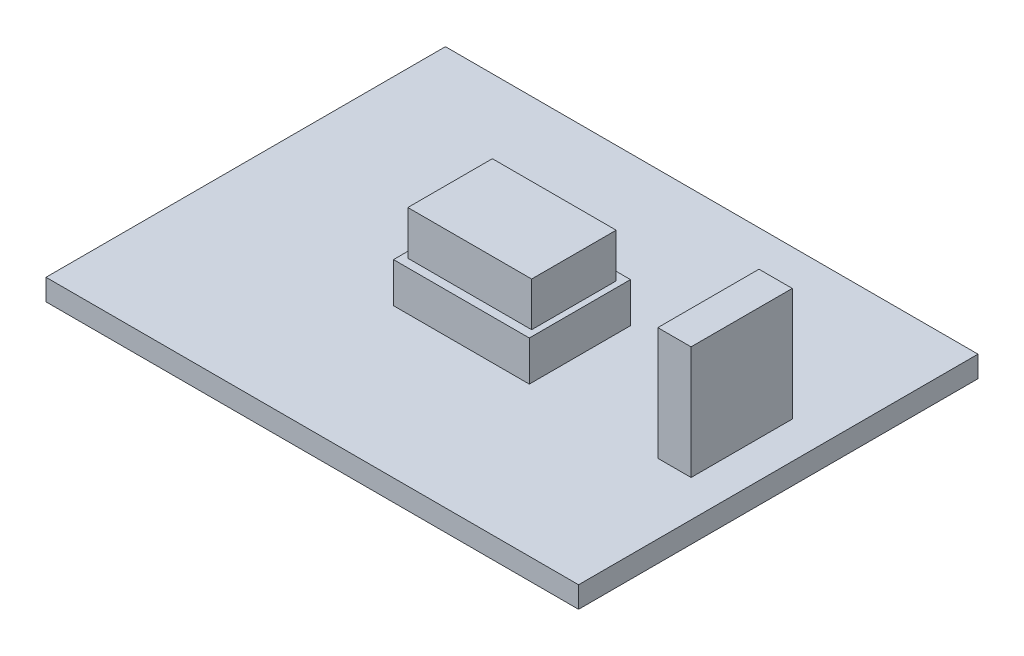
ISO-10303-21;
HEADER;
FILE_DESCRIPTION(('STEP AP214'),'2;1');
FILE_NAME('part.step','',(''),(''),'','','');
FILE_SCHEMA(('AUTOMOTIVE_DESIGN { 1 0 10303 214 1 1 1 1 }'));
ENDSEC;
DATA;
#1=APPLICATION_CONTEXT('core data for automotive mechanical design processes');
#2=APPLICATION_PROTOCOL_DEFINITION('international standard','automotive_design',2000,#1);
#3=PRODUCT_CONTEXT('',#1,'mechanical');
#4=PRODUCT('Part','Part','',(#3));
#5=PRODUCT_RELATED_PRODUCT_CATEGORY('part','',(#4));
#6=PRODUCT_DEFINITION_FORMATION('','',#4);
#7=PRODUCT_DEFINITION_CONTEXT('part definition',#1,'design');
#8=PRODUCT_DEFINITION('design','',#6,#7);
#9=PRODUCT_DEFINITION_SHAPE('','',#8);
#10=(LENGTH_UNIT() NAMED_UNIT(*) SI_UNIT(.MILLI.,.METRE.));
#11=(NAMED_UNIT(*) PLANE_ANGLE_UNIT() SI_UNIT($,.RADIAN.));
#12=(NAMED_UNIT(*) SI_UNIT($,.STERADIAN.) SOLID_ANGLE_UNIT());
#13=UNCERTAINTY_MEASURE_WITH_UNIT(LENGTH_MEASURE(1.E-05),#10,'distance_accuracy_value','');
#14=(GEOMETRIC_REPRESENTATION_CONTEXT(3) GLOBAL_UNCERTAINTY_ASSIGNED_CONTEXT((#13)) GLOBAL_UNIT_ASSIGNED_CONTEXT((#10,
#11,#12)) REPRESENTATION_CONTEXT('',''));
#15=CARTESIAN_POINT('',(0.,0.,0.));
#16=DIRECTION('',(0.,0.,1.));
#17=DIRECTION('',(1.,0.,0.));
#18=AXIS2_PLACEMENT_3D('',#15,#16,#17);
#19=CARTESIAN_POINT('',(0.,1.6,0.));
#20=DIRECTION('',(0.,1.,0.));
#21=DIRECTION('',(0.,0.,1.));
#22=AXIS2_PLACEMENT_3D('',#19,#20,#21);
#23=PLANE('',#22);
#24=DIRECTION('',(0.,0.,1.));
#25=VECTOR('',#24,1.);
#26=CARTESIAN_POINT('',(-5.1,1.6,-3.8));
#27=LINE('',#26,#25);
#28=CARTESIAN_POINT('',(-5.1,1.6,-3.8));
#29=VERTEX_POINT('',#28);
#30=CARTESIAN_POINT('',(-5.1,1.6,3.8));
#31=VERTEX_POINT('',#30);
#32=EDGE_CURVE('E218',#29,#31,#27,.T.);
#33=ORIENTED_EDGE('',*,*,#32,.F.);
#34=DIRECTION('',(-1.,0.,0.));
#35=VECTOR('',#34,1.);
#36=CARTESIAN_POINT('',(5.1,1.6,-3.8));
#37=LINE('',#36,#35);
#38=CARTESIAN_POINT('',(5.1,1.6,-3.8));
#39=VERTEX_POINT('',#38);
#40=EDGE_CURVE('E221',#39,#29,#37,.T.);
#41=ORIENTED_EDGE('',*,*,#40,.F.);
#42=DIRECTION('',(0.,0.,-1.));
#43=VECTOR('',#42,1.);
#44=CARTESIAN_POINT('',(5.1,1.6,3.8));
#45=LINE('',#44,#43);
#46=CARTESIAN_POINT('',(5.1,1.6,3.8));
#47=VERTEX_POINT('',#46);
#48=EDGE_CURVE('E237',#47,#39,#45,.T.);
#49=ORIENTED_EDGE('',*,*,#48,.F.);
#50=DIRECTION('',(1.,0.,0.));
#51=VECTOR('',#50,1.);
#52=CARTESIAN_POINT('',(-5.1,1.6,3.8));
#53=LINE('',#52,#51);
#54=EDGE_CURVE('E234',#31,#47,#53,.T.);
#55=ORIENTED_EDGE('',*,*,#54,.F.);
#56=EDGE_LOOP('',(#33,#41,#49,#55));
#57=FACE_BOUND('',#56,.T.);
#58=DIRECTION('',(0.,0.,1.));
#59=VECTOR('',#58,1.);
#60=CARTESIAN_POINT('',(-20.,1.6,-15.));
#61=LINE('',#60,#59);
#62=CARTESIAN_POINT('',(-20.,1.6,-15.));
#63=VERTEX_POINT('',#62);
#64=CARTESIAN_POINT('',(-20.,1.6,15.));
#65=VERTEX_POINT('',#64);
#66=EDGE_CURVE('E251',#63,#65,#61,.T.);
#67=ORIENTED_EDGE('',*,*,#66,.T.);
#68=DIRECTION('',(1.,0.,0.));
#69=VECTOR('',#68,1.);
#70=CARTESIAN_POINT('',(-20.,1.6,15.));
#71=LINE('',#70,#69);
#72=CARTESIAN_POINT('',(20.,1.6,15.));
#73=VERTEX_POINT('',#72);
#74=EDGE_CURVE('E258',#65,#73,#71,.T.);
#75=ORIENTED_EDGE('',*,*,#74,.T.);
#76=DIRECTION('',(0.,0.,-1.));
#77=VECTOR('',#76,1.);
#78=CARTESIAN_POINT('',(20.,1.6,15.));
#79=LINE('',#78,#77);
#80=CARTESIAN_POINT('',(20.,1.6,-15.));
#81=VERTEX_POINT('',#80);
#82=EDGE_CURVE('E259',#73,#81,#79,.T.);
#83=ORIENTED_EDGE('',*,*,#82,.T.);
#84=DIRECTION('',(-1.,0.,0.));
#85=VECTOR('',#84,1.);
#86=CARTESIAN_POINT('',(20.,1.6,-15.));
#87=LINE('',#86,#85);
#88=EDGE_CURVE('E261',#81,#63,#87,.T.);
#89=ORIENTED_EDGE('',*,*,#88,.T.);
#90=EDGE_LOOP('',(#67,#75,#83,#89));
#91=FACE_BOUND('',#90,.T.);
#92=DIRECTION('',(1.,0.,0.));
#93=VECTOR('',#92,1.);
#94=CARTESIAN_POINT('',(14.75,1.6,3.8));
#95=LINE('',#94,#93);
#96=CARTESIAN_POINT('',(14.75,1.6,3.8));
#97=VERTEX_POINT('',#96);
#98=CARTESIAN_POINT('',(17.25,1.6,3.8));
#99=VERTEX_POINT('',#98);
#100=EDGE_CURVE('E543',#97,#99,#95,.T.);
#101=ORIENTED_EDGE('',*,*,#100,.F.);
#102=DIRECTION('',(0.,0.,1.));
#103=VECTOR('',#102,1.);
#104=CARTESIAN_POINT('',(14.75,1.6,-3.8));
#105=LINE('',#104,#103);
#106=CARTESIAN_POINT('',(14.75,1.6,-3.8));
#107=VERTEX_POINT('',#106);
#108=EDGE_CURVE('E181',#107,#97,#105,.T.);
#109=ORIENTED_EDGE('',*,*,#108,.F.);
#110=DIRECTION('',(-1.,0.,0.));
#111=VECTOR('',#110,1.);
#112=CARTESIAN_POINT('',(17.25,1.6,-3.8));
#113=LINE('',#112,#111);
#114=CARTESIAN_POINT('',(17.25,1.6,-3.8));
#115=VERTEX_POINT('',#114);
#116=EDGE_CURVE('E178',#115,#107,#113,.T.);
#117=ORIENTED_EDGE('',*,*,#116,.F.);
#118=DIRECTION('',(0.,0.,-1.));
#119=VECTOR('',#118,1.);
#120=CARTESIAN_POINT('',(17.25,1.6,3.8));
#121=LINE('',#120,#119);
#122=EDGE_CURVE('E539',#99,#115,#121,.T.);
#123=ORIENTED_EDGE('',*,*,#122,.F.);
#124=EDGE_LOOP('',(#101,#109,#117,#123));
#125=FACE_BOUND('',#124,.T.);
#126=ADVANCED_FACE('F50',(#57,#91,#125),#23,.T.);
#127=CARTESIAN_POINT('',(-20.,1.6,-15.));
#128=DIRECTION('',(1.,0.,0.));
#129=DIRECTION('',(0.,0.,-1.));
#130=AXIS2_PLACEMENT_3D('',#127,#128,#129);
#131=PLANE('',#130);
#132=DIRECTION('',(0.,0.,1.));
#133=VECTOR('',#132,1.);
#134=CARTESIAN_POINT('',(-20.,0.,-15.));
#135=LINE('',#134,#133);
#136=CARTESIAN_POINT('',(-20.,0.,-15.));
#137=VERTEX_POINT('',#136);
#138=CARTESIAN_POINT('',(-20.,0.,15.));
#139=VERTEX_POINT('',#138);
#140=EDGE_CURVE('E252',#137,#139,#135,.T.);
#141=ORIENTED_EDGE('',*,*,#140,.T.);
#142=DIRECTION('',(0.,-1.,0.));
#143=VECTOR('',#142,1.);
#144=CARTESIAN_POINT('',(-20.,1.6,15.));
#145=LINE('',#144,#143);
#146=EDGE_CURVE('E11',#65,#139,#145,.T.);
#147=ORIENTED_EDGE('',*,*,#146,.F.);
#148=ORIENTED_EDGE('',*,*,#66,.F.);
#149=DIRECTION('',(0.,-1.,0.));
#150=VECTOR('',#149,1.);
#151=CARTESIAN_POINT('',(-20.,1.6,-15.));
#152=LINE('',#151,#150);
#153=EDGE_CURVE('E263',#63,#137,#152,.T.);
#154=ORIENTED_EDGE('',*,*,#153,.T.);
#155=EDGE_LOOP('',(#141,#147,#148,#154));
#156=FACE_BOUND('',#155,.T.);
#157=ADVANCED_FACE('F47',(#156),#131,.F.);
#158=CARTESIAN_POINT('',(-20.,1.6,15.));
#159=DIRECTION('',(0.,0.,-1.));
#160=DIRECTION('',(-1.,0.,0.));
#161=AXIS2_PLACEMENT_3D('',#158,#159,#160);
#162=PLANE('',#161);
#163=DIRECTION('',(1.,0.,0.));
#164=VECTOR('',#163,1.);
#165=CARTESIAN_POINT('',(-20.,0.,15.));
#166=LINE('',#165,#164);
#167=CARTESIAN_POINT('',(20.,0.,15.));
#168=VERTEX_POINT('',#167);
#169=EDGE_CURVE('E266',#139,#168,#166,.T.);
#170=ORIENTED_EDGE('',*,*,#169,.T.);
#171=DIRECTION('',(0.,-1.,0.));
#172=VECTOR('',#171,1.);
#173=CARTESIAN_POINT('',(20.,1.6,15.));
#174=LINE('',#173,#172);
#175=EDGE_CURVE('E54',#73,#168,#174,.T.);
#176=ORIENTED_EDGE('',*,*,#175,.F.);
#177=ORIENTED_EDGE('',*,*,#74,.F.);
#178=ORIENTED_EDGE('',*,*,#146,.T.);
#179=EDGE_LOOP('',(#170,#176,#177,#178));
#180=FACE_BOUND('',#179,.T.);
#181=ADVANCED_FACE('F298',(#180),#162,.F.);
#182=CARTESIAN_POINT('',(20.,1.6,15.));
#183=DIRECTION('',(-1.,0.,0.));
#184=DIRECTION('',(0.,0.,1.));
#185=AXIS2_PLACEMENT_3D('',#182,#183,#184);
#186=PLANE('',#185);
#187=DIRECTION('',(0.,0.,-1.));
#188=VECTOR('',#187,1.);
#189=CARTESIAN_POINT('',(20.,0.,15.));
#190=LINE('',#189,#188);
#191=CARTESIAN_POINT('',(20.,0.,-15.));
#192=VERTEX_POINT('',#191);
#193=EDGE_CURVE('E268',#168,#192,#190,.T.);
#194=ORIENTED_EDGE('',*,*,#193,.T.);
#195=DIRECTION('',(0.,-1.,0.));
#196=VECTOR('',#195,1.);
#197=CARTESIAN_POINT('',(20.,1.6,-15.));
#198=LINE('',#197,#196);
#199=EDGE_CURVE('E272',#81,#192,#198,.T.);
#200=ORIENTED_EDGE('',*,*,#199,.F.);
#201=ORIENTED_EDGE('',*,*,#82,.F.);
#202=ORIENTED_EDGE('',*,*,#175,.T.);
#203=EDGE_LOOP('',(#194,#200,#201,#202));
#204=FACE_BOUND('',#203,.T.);
#205=ADVANCED_FACE('F278',(#204),#186,.F.);
#206=CARTESIAN_POINT('',(20.,1.6,-15.));
#207=DIRECTION('',(0.,0.,1.));
#208=DIRECTION('',(1.,0.,0.));
#209=AXIS2_PLACEMENT_3D('',#206,#207,#208);
#210=PLANE('',#209);
#211=DIRECTION('',(-1.,0.,0.));
#212=VECTOR('',#211,1.);
#213=CARTESIAN_POINT('',(20.,0.,-15.));
#214=LINE('',#213,#212);
#215=EDGE_CURVE('E260',#192,#137,#214,.T.);
#216=ORIENTED_EDGE('',*,*,#215,.T.);
#217=ORIENTED_EDGE('',*,*,#153,.F.);
#218=ORIENTED_EDGE('',*,*,#88,.F.);
#219=ORIENTED_EDGE('',*,*,#199,.T.);
#220=EDGE_LOOP('',(#216,#217,#218,#219));
#221=FACE_BOUND('',#220,.T.);
#222=ADVANCED_FACE('F288',(#221),#210,.F.);
#223=CARTESIAN_POINT('',(0.,0.,0.));
#224=DIRECTION('',(0.,1.,0.));
#225=DIRECTION('',(0.,0.,1.));
#226=AXIS2_PLACEMENT_3D('',#223,#224,#225);
#227=PLANE('',#226);
#228=ORIENTED_EDGE('',*,*,#140,.F.);
#229=ORIENTED_EDGE('',*,*,#215,.F.);
#230=ORIENTED_EDGE('',*,*,#193,.F.);
#231=ORIENTED_EDGE('',*,*,#169,.F.);
#232=EDGE_LOOP('',(#228,#229,#230,#231));
#233=FACE_BOUND('',#232,.T.);
#234=ADVANCED_FACE('F286',(#233),#227,.F.);
#235=CARTESIAN_POINT('',(-5.1,4.6,-3.8));
#236=DIRECTION('',(1.,0.,0.));
#237=DIRECTION('',(0.,0.,-1.));
#238=AXIS2_PLACEMENT_3D('',#235,#236,#237);
#239=PLANE('',#238);
#240=ORIENTED_EDGE('',*,*,#32,.T.);
#241=DIRECTION('',(0.,-1.,0.));
#242=VECTOR('',#241,1.);
#243=CARTESIAN_POINT('',(-5.1,4.6,3.8));
#244=LINE('',#243,#242);
#245=CARTESIAN_POINT('',(-5.1,4.6,3.8));
#246=VERTEX_POINT('',#245);
#247=EDGE_CURVE('E248',#246,#31,#244,.T.);
#248=ORIENTED_EDGE('',*,*,#247,.F.);
#249=DIRECTION('',(0.,0.,1.));
#250=VECTOR('',#249,1.);
#251=CARTESIAN_POINT('',(-5.1,4.6,-3.8));
#252=LINE('',#251,#250);
#253=CARTESIAN_POINT('',(-5.1,4.6,-3.8));
#254=VERTEX_POINT('',#253);
#255=EDGE_CURVE('E219',#254,#246,#252,.T.);
#256=ORIENTED_EDGE('',*,*,#255,.F.);
#257=DIRECTION('',(0.,-1.,0.));
#258=VECTOR('',#257,1.);
#259=CARTESIAN_POINT('',(-5.1,4.6,-3.8));
#260=LINE('',#259,#258);
#261=EDGE_CURVE('E229',#254,#29,#260,.T.);
#262=ORIENTED_EDGE('',*,*,#261,.T.);
#263=EDGE_LOOP('',(#240,#248,#256,#262));
#264=FACE_BOUND('',#263,.T.);
#265=ADVANCED_FACE('F315',(#264),#239,.F.);
#266=CARTESIAN_POINT('',(-5.1,4.6,3.8));
#267=DIRECTION('',(0.,0.,-1.));
#268=DIRECTION('',(-1.,0.,0.));
#269=AXIS2_PLACEMENT_3D('',#266,#267,#268);
#270=PLANE('',#269);
#271=ORIENTED_EDGE('',*,*,#54,.T.);
#272=DIRECTION('',(0.,-1.,0.));
#273=VECTOR('',#272,1.);
#274=CARTESIAN_POINT('',(5.1,4.6,3.8));
#275=LINE('',#274,#273);
#276=CARTESIAN_POINT('',(5.1,4.6,3.8));
#277=VERTEX_POINT('',#276);
#278=EDGE_CURVE('E246',#277,#47,#275,.T.);
#279=ORIENTED_EDGE('',*,*,#278,.F.);
#280=DIRECTION('',(1.,0.,0.));
#281=VECTOR('',#280,1.);
#282=CARTESIAN_POINT('',(-5.1,4.6,3.8));
#283=LINE('',#282,#281);
#284=EDGE_CURVE('E224',#246,#277,#283,.T.);
#285=ORIENTED_EDGE('',*,*,#284,.F.);
#286=ORIENTED_EDGE('',*,*,#247,.T.);
#287=EDGE_LOOP('',(#271,#279,#285,#286));
#288=FACE_BOUND('',#287,.T.);
#289=ADVANCED_FACE('F333',(#288),#270,.F.);
#290=CARTESIAN_POINT('',(5.1,4.6,3.8));
#291=DIRECTION('',(-1.,0.,0.));
#292=DIRECTION('',(0.,0.,1.));
#293=AXIS2_PLACEMENT_3D('',#290,#291,#292);
#294=PLANE('',#293);
#295=ORIENTED_EDGE('',*,*,#48,.T.);
#296=DIRECTION('',(0.,-1.,0.));
#297=VECTOR('',#296,1.);
#298=CARTESIAN_POINT('',(5.1,4.6,-3.8));
#299=LINE('',#298,#297);
#300=CARTESIAN_POINT('',(5.1,4.6,-3.8));
#301=VERTEX_POINT('',#300);
#302=EDGE_CURVE('E241',#301,#39,#299,.T.);
#303=ORIENTED_EDGE('',*,*,#302,.F.);
#304=DIRECTION('',(0.,0.,-1.));
#305=VECTOR('',#304,1.);
#306=CARTESIAN_POINT('',(5.1,4.6,3.8));
#307=LINE('',#306,#305);
#308=EDGE_CURVE('E228',#277,#301,#307,.T.);
#309=ORIENTED_EDGE('',*,*,#308,.F.);
#310=ORIENTED_EDGE('',*,*,#278,.T.);
#311=EDGE_LOOP('',(#295,#303,#309,#310));
#312=FACE_BOUND('',#311,.T.);
#313=ADVANCED_FACE('F347',(#312),#294,.F.);
#314=CARTESIAN_POINT('',(5.1,4.6,-3.8));
#315=DIRECTION('',(0.,0.,1.));
#316=DIRECTION('',(1.,0.,0.));
#317=AXIS2_PLACEMENT_3D('',#314,#315,#316);
#318=PLANE('',#317);
#319=ORIENTED_EDGE('',*,*,#40,.T.);
#320=ORIENTED_EDGE('',*,*,#261,.F.);
#321=DIRECTION('',(-1.,0.,0.));
#322=VECTOR('',#321,1.);
#323=CARTESIAN_POINT('',(5.1,4.6,-3.8));
#324=LINE('',#323,#322);
#325=EDGE_CURVE('E226',#301,#254,#324,.T.);
#326=ORIENTED_EDGE('',*,*,#325,.F.);
#327=ORIENTED_EDGE('',*,*,#302,.T.);
#328=EDGE_LOOP('',(#319,#320,#326,#327));
#329=FACE_BOUND('',#328,.T.);
#330=ADVANCED_FACE('F357',(#329),#318,.F.);
#331=CARTESIAN_POINT('',(0.,4.6,0.));
#332=DIRECTION('',(0.,1.,0.));
#333=DIRECTION('',(0.,0.,1.));
#334=AXIS2_PLACEMENT_3D('',#331,#332,#333);
#335=PLANE('',#334);
#336=DIRECTION('',(0.,0.,1.));
#337=VECTOR('',#336,1.);
#338=CARTESIAN_POINT('',(-4.65,4.6,-3.175));
#339=LINE('',#338,#337);
#340=CARTESIAN_POINT('',(-4.65,4.6,-3.175));
#341=VERTEX_POINT('',#340);
#342=CARTESIAN_POINT('',(-4.65,4.6,3.175));
#343=VERTEX_POINT('',#342);
#344=EDGE_CURVE('E70',#341,#343,#339,.T.);
#345=ORIENTED_EDGE('',*,*,#344,.F.);
#346=DIRECTION('',(-1.,0.,0.));
#347=VECTOR('',#346,1.);
#348=CARTESIAN_POINT('',(4.65,4.6,-3.175));
#349=LINE('',#348,#347);
#350=CARTESIAN_POINT('',(4.65,4.6,-3.175));
#351=VERTEX_POINT('',#350);
#352=EDGE_CURVE('E195',#351,#341,#349,.T.);
#353=ORIENTED_EDGE('',*,*,#352,.F.);
#354=DIRECTION('',(0.,0.,-1.));
#355=VECTOR('',#354,1.);
#356=CARTESIAN_POINT('',(4.65,4.6,3.175));
#357=LINE('',#356,#355);
#358=CARTESIAN_POINT('',(4.65,4.6,3.175));
#359=VERTEX_POINT('',#358);
#360=EDGE_CURVE('E204',#359,#351,#357,.T.);
#361=ORIENTED_EDGE('',*,*,#360,.F.);
#362=DIRECTION('',(1.,0.,0.));
#363=VECTOR('',#362,1.);
#364=CARTESIAN_POINT('',(-4.65,4.6,3.175));
#365=LINE('',#364,#363);
#366=EDGE_CURVE('E188',#343,#359,#365,.T.);
#367=ORIENTED_EDGE('',*,*,#366,.F.);
#368=EDGE_LOOP('',(#345,#353,#361,#367));
#369=FACE_BOUND('',#368,.T.);
#370=ORIENTED_EDGE('',*,*,#255,.T.);
#371=ORIENTED_EDGE('',*,*,#284,.T.);
#372=ORIENTED_EDGE('',*,*,#308,.T.);
#373=ORIENTED_EDGE('',*,*,#325,.T.);
#374=EDGE_LOOP('',(#370,#371,#372,#373));
#375=FACE_BOUND('',#374,.T.);
#376=ADVANCED_FACE('F369',(#369,#375),#335,.T.);
#377=CARTESIAN_POINT('',(-4.65,7.9,-3.175));
#378=DIRECTION('',(1.,0.,0.));
#379=DIRECTION('',(0.,0.,-1.));
#380=AXIS2_PLACEMENT_3D('',#377,#378,#379);
#381=PLANE('',#380);
#382=ORIENTED_EDGE('',*,*,#344,.T.);
#383=DIRECTION('',(0.,-1.,0.));
#384=VECTOR('',#383,1.);
#385=CARTESIAN_POINT('',(-4.65,7.9,3.175));
#386=LINE('',#385,#384);
#387=CARTESIAN_POINT('',(-4.65,7.9,3.175));
#388=VERTEX_POINT('',#387);
#389=EDGE_CURVE('E216',#388,#343,#386,.T.);
#390=ORIENTED_EDGE('',*,*,#389,.F.);
#391=DIRECTION('',(0.,0.,1.));
#392=VECTOR('',#391,1.);
#393=CARTESIAN_POINT('',(-4.65,7.9,-3.175));
#394=LINE('',#393,#392);
#395=CARTESIAN_POINT('',(-4.65,7.9,-3.175));
#396=VERTEX_POINT('',#395);
#397=EDGE_CURVE('E191',#396,#388,#394,.T.);
#398=ORIENTED_EDGE('',*,*,#397,.F.);
#399=DIRECTION('',(0.,-1.,0.));
#400=VECTOR('',#399,1.);
#401=CARTESIAN_POINT('',(-4.65,7.9,-3.175));
#402=LINE('',#401,#400);
#403=EDGE_CURVE('E199',#396,#341,#402,.T.);
#404=ORIENTED_EDGE('',*,*,#403,.T.);
#405=EDGE_LOOP('',(#382,#390,#398,#404));
#406=FACE_BOUND('',#405,.T.);
#407=ADVANCED_FACE('F381',(#406),#381,.F.);
#408=CARTESIAN_POINT('',(-4.65,7.9,3.175));
#409=DIRECTION('',(0.,0.,-1.));
#410=DIRECTION('',(-1.,0.,0.));
#411=AXIS2_PLACEMENT_3D('',#408,#409,#410);
#412=PLANE('',#411);
#413=ORIENTED_EDGE('',*,*,#366,.T.);
#414=DIRECTION('',(0.,-1.,0.));
#415=VECTOR('',#414,1.);
#416=CARTESIAN_POINT('',(4.65,7.9,3.175));
#417=LINE('',#416,#415);
#418=CARTESIAN_POINT('',(4.65,7.9,3.175));
#419=VERTEX_POINT('',#418);
#420=EDGE_CURVE('E213',#419,#359,#417,.T.);
#421=ORIENTED_EDGE('',*,*,#420,.F.);
#422=DIRECTION('',(1.,0.,0.));
#423=VECTOR('',#422,1.);
#424=CARTESIAN_POINT('',(-4.65,7.9,3.175));
#425=LINE('',#424,#423);
#426=EDGE_CURVE('E193',#388,#419,#425,.T.);
#427=ORIENTED_EDGE('',*,*,#426,.F.);
#428=ORIENTED_EDGE('',*,*,#389,.T.);
#429=EDGE_LOOP('',(#413,#421,#427,#428));
#430=FACE_BOUND('',#429,.T.);
#431=ADVANCED_FACE('F395',(#430),#412,.F.);
#432=CARTESIAN_POINT('',(4.65,7.9,3.175));
#433=DIRECTION('',(-1.,0.,0.));
#434=DIRECTION('',(0.,0.,1.));
#435=AXIS2_PLACEMENT_3D('',#432,#433,#434);
#436=PLANE('',#435);
#437=ORIENTED_EDGE('',*,*,#360,.T.);
#438=DIRECTION('',(0.,-1.,0.));
#439=VECTOR('',#438,1.);
#440=CARTESIAN_POINT('',(4.65,7.9,-3.175));
#441=LINE('',#440,#439);
#442=CARTESIAN_POINT('',(4.65,7.9,-3.175));
#443=VERTEX_POINT('',#442);
#444=EDGE_CURVE('E209',#443,#351,#441,.T.);
#445=ORIENTED_EDGE('',*,*,#444,.F.);
#446=DIRECTION('',(0.,0.,-1.));
#447=VECTOR('',#446,1.);
#448=CARTESIAN_POINT('',(4.65,7.9,3.175));
#449=LINE('',#448,#447);
#450=EDGE_CURVE('E197',#419,#443,#449,.T.);
#451=ORIENTED_EDGE('',*,*,#450,.F.);
#452=ORIENTED_EDGE('',*,*,#420,.T.);
#453=EDGE_LOOP('',(#437,#445,#451,#452));
#454=FACE_BOUND('',#453,.T.);
#455=ADVANCED_FACE('F404',(#454),#436,.F.);
#456=CARTESIAN_POINT('',(4.65,7.9,-3.175));
#457=DIRECTION('',(0.,0.,1.));
#458=DIRECTION('',(1.,0.,0.));
#459=AXIS2_PLACEMENT_3D('',#456,#457,#458);
#460=PLANE('',#459);
#461=ORIENTED_EDGE('',*,*,#352,.T.);
#462=ORIENTED_EDGE('',*,*,#403,.F.);
#463=DIRECTION('',(-1.,0.,0.));
#464=VECTOR('',#463,1.);
#465=CARTESIAN_POINT('',(4.65,7.9,-3.175));
#466=LINE('',#465,#464);
#467=EDGE_CURVE('E200',#443,#396,#466,.T.);
#468=ORIENTED_EDGE('',*,*,#467,.F.);
#469=ORIENTED_EDGE('',*,*,#444,.T.);
#470=EDGE_LOOP('',(#461,#462,#468,#469));
#471=FACE_BOUND('',#470,.T.);
#472=ADVANCED_FACE('F418',(#471),#460,.F.);
#473=CARTESIAN_POINT('',(0.,7.9,0.));
#474=DIRECTION('',(0.,1.,0.));
#475=DIRECTION('',(0.,0.,1.));
#476=AXIS2_PLACEMENT_3D('',#473,#474,#475);
#477=PLANE('',#476);
#478=ORIENTED_EDGE('',*,*,#397,.T.);
#479=ORIENTED_EDGE('',*,*,#426,.T.);
#480=ORIENTED_EDGE('',*,*,#450,.T.);
#481=ORIENTED_EDGE('',*,*,#467,.T.);
#482=EDGE_LOOP('',(#478,#479,#480,#481));
#483=FACE_BOUND('',#482,.T.);
#484=ADVANCED_FACE('F430',(#483),#477,.T.);
#485=CARTESIAN_POINT('',(14.75,10.1,-3.8));
#486=DIRECTION('',(1.,0.,0.));
#487=DIRECTION('',(0.,0.,-1.));
#488=AXIS2_PLACEMENT_3D('',#485,#486,#487);
#489=PLANE('',#488);
#490=ORIENTED_EDGE('',*,*,#108,.T.);
#491=DIRECTION('',(0.,-1.,0.));
#492=VECTOR('',#491,1.);
#493=CARTESIAN_POINT('',(14.75,10.1,3.8));
#494=LINE('',#493,#492);
#495=CARTESIAN_POINT('',(14.75,10.1,3.8));
#496=VERTEX_POINT('',#495);
#497=EDGE_CURVE('E163',#496,#97,#494,.T.);
#498=ORIENTED_EDGE('',*,*,#497,.F.);
#499=DIRECTION('',(0.,0.,1.));
#500=VECTOR('',#499,1.);
#501=CARTESIAN_POINT('',(14.75,10.1,-3.8));
#502=LINE('',#501,#500);
#503=CARTESIAN_POINT('',(14.75,10.1,-3.8));
#504=VERTEX_POINT('',#503);
#505=EDGE_CURVE('E173',#504,#496,#502,.T.);
#506=ORIENTED_EDGE('',*,*,#505,.F.);
#507=DIRECTION('',(0.,-1.,0.));
#508=VECTOR('',#507,1.);
#509=CARTESIAN_POINT('',(14.75,10.1,-3.8));
#510=LINE('',#509,#508);
#511=EDGE_CURVE('E538',#504,#107,#510,.T.);
#512=ORIENTED_EDGE('',*,*,#511,.T.);
#513=EDGE_LOOP('',(#490,#498,#506,#512));
#514=FACE_BOUND('',#513,.T.);
#515=ADVANCED_FACE('F182',(#514),#489,.F.);
#516=CARTESIAN_POINT('',(14.75,10.1,3.8));
#517=DIRECTION('',(0.,0.,-1.));
#518=DIRECTION('',(-1.,0.,0.));
#519=AXIS2_PLACEMENT_3D('',#516,#517,#518);
#520=PLANE('',#519);
#521=ORIENTED_EDGE('',*,*,#100,.T.);
#522=DIRECTION('',(0.,-1.,0.));
#523=VECTOR('',#522,1.);
#524=CARTESIAN_POINT('',(17.25,10.1,3.8));
#525=LINE('',#524,#523);
#526=CARTESIAN_POINT('',(17.25,10.1,3.8));
#527=VERTEX_POINT('',#526);
#528=EDGE_CURVE('E170',#527,#99,#525,.T.);
#529=ORIENTED_EDGE('',*,*,#528,.F.);
#530=DIRECTION('',(1.,0.,0.));
#531=VECTOR('',#530,1.);
#532=CARTESIAN_POINT('',(14.75,10.1,3.8));
#533=LINE('',#532,#531);
#534=EDGE_CURVE('E159',#496,#527,#533,.T.);
#535=ORIENTED_EDGE('',*,*,#534,.F.);
#536=ORIENTED_EDGE('',*,*,#497,.T.);
#537=EDGE_LOOP('',(#521,#529,#535,#536));
#538=FACE_BOUND('',#537,.T.);
#539=ADVANCED_FACE('F165',(#538),#520,.F.);
#540=CARTESIAN_POINT('',(17.25,10.1,3.8));
#541=DIRECTION('',(-1.,0.,0.));
#542=DIRECTION('',(0.,0.,1.));
#543=AXIS2_PLACEMENT_3D('',#540,#541,#542);
#544=PLANE('',#543);
#545=ORIENTED_EDGE('',*,*,#122,.T.);
#546=DIRECTION('',(0.,-1.,0.));
#547=VECTOR('',#546,1.);
#548=CARTESIAN_POINT('',(17.25,10.1,-3.8));
#549=LINE('',#548,#547);
#550=CARTESIAN_POINT('',(17.25,10.1,-3.8));
#551=VERTEX_POINT('',#550);
#552=EDGE_CURVE('E65',#551,#115,#549,.T.);
#553=ORIENTED_EDGE('',*,*,#552,.F.);
#554=DIRECTION('',(0.,0.,-1.));
#555=VECTOR('',#554,1.);
#556=CARTESIAN_POINT('',(17.25,10.1,3.8));
#557=LINE('',#556,#555);
#558=EDGE_CURVE('E168',#527,#551,#557,.T.);
#559=ORIENTED_EDGE('',*,*,#558,.F.);
#560=ORIENTED_EDGE('',*,*,#528,.T.);
#561=EDGE_LOOP('',(#545,#553,#559,#560));
#562=FACE_BOUND('',#561,.T.);
#563=ADVANCED_FACE('F456',(#562),#544,.F.);
#564=CARTESIAN_POINT('',(17.25,10.1,-3.8));
#565=DIRECTION('',(0.,0.,1.));
#566=DIRECTION('',(1.,0.,0.));
#567=AXIS2_PLACEMENT_3D('',#564,#565,#566);
#568=PLANE('',#567);
#569=ORIENTED_EDGE('',*,*,#116,.T.);
#570=ORIENTED_EDGE('',*,*,#511,.F.);
#571=DIRECTION('',(-1.,0.,0.));
#572=VECTOR('',#571,1.);
#573=CARTESIAN_POINT('',(17.25,10.1,-3.8));
#574=LINE('',#573,#572);
#575=EDGE_CURVE('E174',#551,#504,#574,.T.);
#576=ORIENTED_EDGE('',*,*,#575,.F.);
#577=ORIENTED_EDGE('',*,*,#552,.T.);
#578=EDGE_LOOP('',(#569,#570,#576,#577));
#579=FACE_BOUND('',#578,.T.);
#580=ADVANCED_FACE('F467',(#579),#568,.F.);
#581=CARTESIAN_POINT('',(0.,10.1,0.));
#582=DIRECTION('',(0.,1.,0.));
#583=DIRECTION('',(0.,0.,1.));
#584=AXIS2_PLACEMENT_3D('',#581,#582,#583);
#585=PLANE('',#584);
#586=ORIENTED_EDGE('',*,*,#505,.T.);
#587=ORIENTED_EDGE('',*,*,#534,.T.);
#588=ORIENTED_EDGE('',*,*,#558,.T.);
#589=ORIENTED_EDGE('',*,*,#575,.T.);
#590=EDGE_LOOP('',(#586,#587,#588,#589));
#591=FACE_BOUND('',#590,.T.);
#592=ADVANCED_FACE('F172',(#591),#585,.T.);
#593=CLOSED_SHELL('',(#126,#157,#181,#205,#222,#234,#265,#289,#313,#330,#376,#407,#431,#455,
#472,#484,#515,#539,#563,#580,#592));
#594=MANIFOLD_SOLID_BREP('B2',#593);
#595=ADVANCED_BREP_SHAPE_REPRESENTATION('',(#18,#594),#14);
#596=SHAPE_DEFINITION_REPRESENTATION(#9,#595);
ENDSEC;
END-ISO-10303-21;
